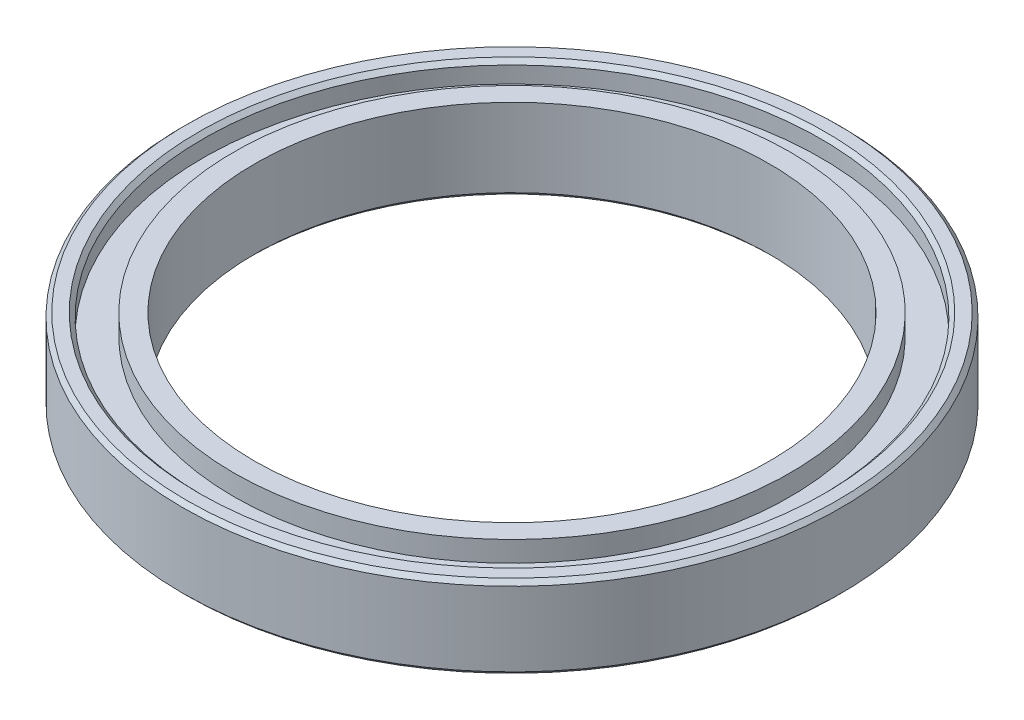
ISO-10303-21;
HEADER;
FILE_DESCRIPTION(('STEP AP214'),'2;1');
FILE_NAME('part.step','',(''),(''),'','','');
FILE_SCHEMA(('AUTOMOTIVE_DESIGN { 1 0 10303 214 1 1 1 1 }'));
ENDSEC;
DATA;
#1=APPLICATION_CONTEXT('core data for automotive mechanical design processes');
#2=APPLICATION_PROTOCOL_DEFINITION('international standard','automotive_design',2000,#1);
#3=PRODUCT_CONTEXT('',#1,'mechanical');
#4=PRODUCT('Part','Part','',(#3));
#5=PRODUCT_RELATED_PRODUCT_CATEGORY('part','',(#4));
#6=PRODUCT_DEFINITION_FORMATION('','',#4);
#7=PRODUCT_DEFINITION_CONTEXT('part definition',#1,'design');
#8=PRODUCT_DEFINITION('design','',#6,#7);
#9=PRODUCT_DEFINITION_SHAPE('','',#8);
#10=(LENGTH_UNIT() NAMED_UNIT(*) SI_UNIT(.MILLI.,.METRE.));
#11=(NAMED_UNIT(*) PLANE_ANGLE_UNIT() SI_UNIT($,.RADIAN.));
#12=(NAMED_UNIT(*) SI_UNIT($,.STERADIAN.) SOLID_ANGLE_UNIT());
#13=UNCERTAINTY_MEASURE_WITH_UNIT(LENGTH_MEASURE(1.E-05),#10,'distance_accuracy_value','');
#14=(GEOMETRIC_REPRESENTATION_CONTEXT(3) GLOBAL_UNCERTAINTY_ASSIGNED_CONTEXT((#13)) GLOBAL_UNIT_ASSIGNED_CONTEXT((#10,
#11,#12)) REPRESENTATION_CONTEXT('',''));
#15=CARTESIAN_POINT('',(0.,0.,0.));
#16=DIRECTION('',(0.,0.,1.));
#17=DIRECTION('',(1.,0.,0.));
#18=AXIS2_PLACEMENT_3D('',#15,#16,#17);
#19=CARTESIAN_POINT('',(0.,0.,0.));
#20=DIRECTION('',(0.,1.,0.));
#21=DIRECTION('',(0.,0.,1.));
#22=AXIS2_PLACEMENT_3D('',#19,#20,#21);
#23=PLANE('',#22);
#24=CARTESIAN_POINT('',(0.,0.,0.));
#25=DIRECTION('',(0.,1.,0.));
#26=DIRECTION('',(0.,0.,1.));
#27=AXIS2_PLACEMENT_3D('',#24,#25,#26);
#28=CIRCLE('',#27,13.3);
#29=CARTESIAN_POINT('',(0.,0.,13.3));
#30=VERTEX_POINT('',#29);
#31=EDGE_CURVE('E55',#30,#30,#28,.F.);
#32=ORIENTED_EDGE('',*,*,#31,.T.);
#33=EDGE_LOOP('',(#32));
#34=FACE_BOUND('',#33,.T.);
#35=CARTESIAN_POINT('',(0.,0.,0.));
#36=DIRECTION('',(0.,1.,0.));
#37=DIRECTION('',(0.,0.,1.));
#38=AXIS2_PLACEMENT_3D('',#35,#36,#37);
#39=CIRCLE('',#38,12.7);
#40=CARTESIAN_POINT('',(0.,0.,12.7));
#41=VERTEX_POINT('',#40);
#42=EDGE_CURVE('E59',#41,#41,#39,.T.);
#43=ORIENTED_EDGE('',*,*,#42,.T.);
#44=EDGE_LOOP('',(#43));
#45=FACE_BOUND('',#44,.T.);
#46=ADVANCED_FACE('F43',(#34,#45),#23,.F.);
#47=CARTESIAN_POINT('',(0.,4.,0.));
#48=DIRECTION('',(0.,1.,0.));
#49=DIRECTION('',(0.,0.,1.));
#50=AXIS2_PLACEMENT_3D('',#47,#48,#49);
#51=PLANE('',#50);
#52=CARTESIAN_POINT('',(0.,4.,0.));
#53=DIRECTION('',(0.,1.,0.));
#54=DIRECTION('',(0.,0.,1.));
#55=AXIS2_PLACEMENT_3D('',#52,#53,#54);
#56=CIRCLE('',#55,12.5);
#57=CARTESIAN_POINT('',(0.,4.,12.5));
#58=VERTEX_POINT('',#57);
#59=EDGE_CURVE('E88',#58,#58,#56,.T.);
#60=ORIENTED_EDGE('',*,*,#59,.F.);
#61=EDGE_LOOP('',(#60));
#62=FACE_BOUND('',#61,.T.);
#63=CARTESIAN_POINT('',(0.,4.,0.));
#64=DIRECTION('',(0.,1.,0.));
#65=DIRECTION('',(0.,0.,1.));
#66=AXIS2_PLACEMENT_3D('',#63,#64,#65);
#67=CIRCLE('',#66,13.5);
#68=CARTESIAN_POINT('',(0.,4.,13.5));
#69=VERTEX_POINT('',#68);
#70=EDGE_CURVE('E95',#69,#69,#67,.T.);
#71=ORIENTED_EDGE('',*,*,#70,.T.);
#72=EDGE_LOOP('',(#71));
#73=FACE_BOUND('',#72,.T.);
#74=ADVANCED_FACE('F129',(#62,#73),#51,.T.);
#75=CARTESIAN_POINT('',(0.,4.,0.));
#76=DIRECTION('',(0.,1.,0.));
#77=DIRECTION('',(0.,0.,1.));
#78=AXIS2_PLACEMENT_3D('',#75,#76,#77);
#79=CIRCLE('',#78,15.8);
#80=CARTESIAN_POINT('',(0.,4.,15.8));
#81=VERTEX_POINT('',#80);
#82=EDGE_CURVE('E82',#81,#81,#79,.T.);
#83=ORIENTED_EDGE('',*,*,#82,.T.);
#84=EDGE_LOOP('',(#83));
#85=FACE_BOUND('',#84,.T.);
#86=CARTESIAN_POINT('',(0.,4.,0.));
#87=DIRECTION('',(0.,1.,0.));
#88=DIRECTION('',(0.,0.,1.));
#89=AXIS2_PLACEMENT_3D('',#86,#87,#88);
#90=CIRCLE('',#89,15.2);
#91=CARTESIAN_POINT('',(0.,4.,15.2));
#92=VERTEX_POINT('',#91);
#93=EDGE_CURVE('E85',#92,#92,#90,.F.);
#94=ORIENTED_EDGE('',*,*,#93,.T.);
#95=EDGE_LOOP('',(#94));
#96=FACE_BOUND('',#95,.T.);
#97=ADVANCED_FACE('F137',(#85,#96),#51,.T.);
#98=CARTESIAN_POINT('',(0.,0.,0.));
#99=DIRECTION('',(0.,1.,0.));
#100=DIRECTION('',(0.,0.,1.));
#101=AXIS2_PLACEMENT_3D('',#98,#99,#100);
#102=CIRCLE('',#101,15.8);
#103=CARTESIAN_POINT('',(0.,0.,15.8));
#104=VERTEX_POINT('',#103);
#105=EDGE_CURVE('E67',#104,#104,#102,.F.);
#106=ORIENTED_EDGE('',*,*,#105,.T.);
#107=EDGE_LOOP('',(#106));
#108=FACE_BOUND('',#107,.T.);
#109=CARTESIAN_POINT('',(0.,0.,0.));
#110=DIRECTION('',(0.,1.,0.));
#111=DIRECTION('',(0.,0.,1.));
#112=AXIS2_PLACEMENT_3D('',#109,#110,#111);
#113=CIRCLE('',#112,15.2);
#114=CARTESIAN_POINT('',(0.,0.,15.2));
#115=VERTEX_POINT('',#114);
#116=EDGE_CURVE('E70',#115,#115,#113,.T.);
#117=ORIENTED_EDGE('',*,*,#116,.T.);
#118=EDGE_LOOP('',(#117));
#119=FACE_BOUND('',#118,.T.);
#120=ADVANCED_FACE('F132',(#108,#119),#23,.F.);
#121=CARTESIAN_POINT('',(0.,4.,0.));
#122=DIRECTION('',(0.,-1.,0.));
#123=DIRECTION('',(0.,0.,-1.));
#124=AXIS2_PLACEMENT_3D('',#121,#122,#123);
#125=CYLINDRICAL_SURFACE('',#124,16.);
#126=CARTESIAN_POINT('',(0.,3.8,0.));
#127=DIRECTION('',(0.,1.,0.));
#128=DIRECTION('',(0.,0.,1.));
#129=AXIS2_PLACEMENT_3D('',#126,#127,#128);
#130=CIRCLE('',#129,16.);
#131=CARTESIAN_POINT('',(0.,3.8,16.));
#132=VERTEX_POINT('',#131);
#133=EDGE_CURVE('E76',#132,#132,#130,.F.);
#134=ORIENTED_EDGE('',*,*,#133,.T.);
#135=EDGE_LOOP('',(#134));
#136=FACE_BOUND('',#135,.T.);
#137=CARTESIAN_POINT('',(0.,0.199999999999999,0.));
#138=DIRECTION('',(0.,1.,0.));
#139=DIRECTION('',(0.,0.,1.));
#140=AXIS2_PLACEMENT_3D('',#137,#138,#139);
#141=CIRCLE('',#140,16.);
#142=CARTESIAN_POINT('',(0.,0.199999999999999,16.));
#143=VERTEX_POINT('',#142);
#144=EDGE_CURVE('E79',#143,#143,#141,.T.);
#145=ORIENTED_EDGE('',*,*,#144,.T.);
#146=EDGE_LOOP('',(#145));
#147=FACE_BOUND('',#146,.T.);
#148=ADVANCED_FACE('F143',(#136,#147),#125,.T.);
#149=CARTESIAN_POINT('',(0.,4.,0.));
#150=DIRECTION('',(0.,-1.,0.));
#151=DIRECTION('',(0.,0.,-1.));
#152=AXIS2_PLACEMENT_3D('',#149,#150,#151);
#153=CYLINDRICAL_SURFACE('',#152,12.5);
#154=CARTESIAN_POINT('',(0.,0.19999999999999,0.));
#155=DIRECTION('',(0.,1.,0.));
#156=DIRECTION('',(0.,0.,1.));
#157=AXIS2_PLACEMENT_3D('',#154,#155,#156);
#158=CIRCLE('',#157,12.5);
#159=CARTESIAN_POINT('',(0.,0.19999999999999,12.5));
#160=VERTEX_POINT('',#159);
#161=EDGE_CURVE('E10',#160,#160,#158,.F.);
#162=ORIENTED_EDGE('',*,*,#161,.T.);
#163=EDGE_LOOP('',(#162));
#164=FACE_BOUND('',#163,.T.);
#165=ORIENTED_EDGE('',*,*,#59,.T.);
#166=EDGE_LOOP('',(#165));
#167=FACE_BOUND('',#166,.T.);
#168=ADVANCED_FACE('F148',(#164,#167),#153,.F.);
#169=CARTESIAN_POINT('',(0.,3.,0.));
#170=DIRECTION('',(0.,1.,0.));
#171=DIRECTION('',(0.,0.,1.));
#172=AXIS2_PLACEMENT_3D('',#169,#170,#171);
#173=CYLINDRICAL_SURFACE('',#172,15.);
#174=CARTESIAN_POINT('',(0.,3.8,0.));
#175=DIRECTION('',(0.,1.,0.));
#176=DIRECTION('',(0.,0.,1.));
#177=AXIS2_PLACEMENT_3D('',#174,#175,#176);
#178=CIRCLE('',#177,15.);
#179=CARTESIAN_POINT('',(0.,3.8,15.));
#180=VERTEX_POINT('',#179);
#181=EDGE_CURVE('E73',#180,#180,#178,.T.);
#182=ORIENTED_EDGE('',*,*,#181,.T.);
#183=EDGE_LOOP('',(#182));
#184=FACE_BOUND('',#183,.T.);
#185=CARTESIAN_POINT('',(0.,3.,0.));
#186=DIRECTION('',(0.,1.,0.));
#187=DIRECTION('',(0.,0.,1.));
#188=AXIS2_PLACEMENT_3D('',#185,#186,#187);
#189=CIRCLE('',#188,15.);
#190=CARTESIAN_POINT('',(0.,3.,15.));
#191=VERTEX_POINT('',#190);
#192=EDGE_CURVE('E91',#191,#191,#189,.T.);
#193=ORIENTED_EDGE('',*,*,#192,.F.);
#194=EDGE_LOOP('',(#193));
#195=FACE_BOUND('',#194,.T.);
#196=ADVANCED_FACE('F205',(#184,#195),#173,.F.);
#197=CARTESIAN_POINT('',(0.,3.,0.));
#198=DIRECTION('',(0.,1.,0.));
#199=DIRECTION('',(0.,0.,1.));
#200=AXIS2_PLACEMENT_3D('',#197,#198,#199);
#201=PLANE('',#200);
#202=CARTESIAN_POINT('',(0.,3.,0.));
#203=DIRECTION('',(0.,1.,0.));
#204=DIRECTION('',(0.,0.,1.));
#205=AXIS2_PLACEMENT_3D('',#202,#203,#204);
#206=CIRCLE('',#205,13.5);
#207=CARTESIAN_POINT('',(0.,3.,13.5));
#208=VERTEX_POINT('',#207);
#209=EDGE_CURVE('E94',#208,#208,#206,.T.);
#210=ORIENTED_EDGE('',*,*,#209,.F.);
#211=EDGE_LOOP('',(#210));
#212=FACE_BOUND('',#211,.T.);
#213=ORIENTED_EDGE('',*,*,#192,.T.);
#214=EDGE_LOOP('',(#213));
#215=FACE_BOUND('',#214,.T.);
#216=ADVANCED_FACE('F125',(#212,#215),#201,.T.);
#217=CARTESIAN_POINT('',(0.,3.,0.));
#218=DIRECTION('',(0.,1.,0.));
#219=DIRECTION('',(0.,0.,1.));
#220=AXIS2_PLACEMENT_3D('',#217,#218,#219);
#221=CYLINDRICAL_SURFACE('',#220,13.5);
#222=ORIENTED_EDGE('',*,*,#209,.T.);
#223=EDGE_LOOP('',(#222));
#224=FACE_BOUND('',#223,.T.);
#225=ORIENTED_EDGE('',*,*,#70,.F.);
#226=EDGE_LOOP('',(#225));
#227=FACE_BOUND('',#226,.T.);
#228=ADVANCED_FACE('F117',(#224,#227),#221,.T.);
#229=CARTESIAN_POINT('',(0.,1.,0.));
#230=DIRECTION('',(0.,-1.,0.));
#231=DIRECTION('',(0.,0.,-1.));
#232=AXIS2_PLACEMENT_3D('',#229,#230,#231);
#233=CYLINDRICAL_SURFACE('',#232,15.);
#234=CARTESIAN_POINT('',(0.,0.199999999999997,0.));
#235=DIRECTION('',(0.,1.,0.));
#236=DIRECTION('',(0.,0.,1.));
#237=AXIS2_PLACEMENT_3D('',#234,#235,#236);
#238=CIRCLE('',#237,15.);
#239=CARTESIAN_POINT('',(0.,0.199999999999997,15.));
#240=VERTEX_POINT('',#239);
#241=EDGE_CURVE('E64',#240,#240,#238,.F.);
#242=ORIENTED_EDGE('',*,*,#241,.T.);
#243=EDGE_LOOP('',(#242));
#244=FACE_BOUND('',#243,.T.);
#245=CARTESIAN_POINT('',(0.,1.,0.));
#246=DIRECTION('',(0.,-1.,0.));
#247=DIRECTION('',(0.,0.,-1.));
#248=AXIS2_PLACEMENT_3D('',#245,#246,#247);
#249=CIRCLE('',#248,15.);
#250=CARTESIAN_POINT('',(0.,1.,-15.));
#251=VERTEX_POINT('',#250);
#252=EDGE_CURVE('E98',#251,#251,#249,.T.);
#253=ORIENTED_EDGE('',*,*,#252,.F.);
#254=EDGE_LOOP('',(#253));
#255=FACE_BOUND('',#254,.T.);
#256=ADVANCED_FACE('F112',(#244,#255),#233,.F.);
#257=CARTESIAN_POINT('',(0.,1.,0.));
#258=DIRECTION('',(0.,-1.,0.));
#259=DIRECTION('',(0.,0.,-1.));
#260=AXIS2_PLACEMENT_3D('',#257,#258,#259);
#261=PLANE('',#260);
#262=CARTESIAN_POINT('',(0.,1.,0.));
#263=DIRECTION('',(0.,-1.,0.));
#264=DIRECTION('',(0.,0.,-1.));
#265=AXIS2_PLACEMENT_3D('',#262,#263,#264);
#266=CIRCLE('',#265,13.5);
#267=CARTESIAN_POINT('',(0.,1.,-13.5));
#268=VERTEX_POINT('',#267);
#269=EDGE_CURVE('E103',#268,#268,#266,.T.);
#270=ORIENTED_EDGE('',*,*,#269,.F.);
#271=EDGE_LOOP('',(#270));
#272=FACE_BOUND('',#271,.T.);
#273=ORIENTED_EDGE('',*,*,#252,.T.);
#274=EDGE_LOOP('',(#273));
#275=FACE_BOUND('',#274,.T.);
#276=ADVANCED_FACE('F109',(#272,#275),#261,.T.);
#277=CARTESIAN_POINT('',(0.,1.,0.));
#278=DIRECTION('',(0.,-1.,0.));
#279=DIRECTION('',(0.,0.,-1.));
#280=AXIS2_PLACEMENT_3D('',#277,#278,#279);
#281=CYLINDRICAL_SURFACE('',#280,13.5);
#282=CARTESIAN_POINT('',(0.,0.200000000000004,0.));
#283=DIRECTION('',(0.,1.,0.));
#284=DIRECTION('',(0.,0.,1.));
#285=AXIS2_PLACEMENT_3D('',#282,#283,#284);
#286=CIRCLE('',#285,13.5);
#287=CARTESIAN_POINT('',(0.,0.200000000000004,13.5));
#288=VERTEX_POINT('',#287);
#289=EDGE_CURVE('E51',#288,#288,#286,.T.);
#290=ORIENTED_EDGE('',*,*,#289,.T.);
#291=EDGE_LOOP('',(#290));
#292=FACE_BOUND('',#291,.T.);
#293=ORIENTED_EDGE('',*,*,#269,.T.);
#294=EDGE_LOOP('',(#293));
#295=FACE_BOUND('',#294,.T.);
#296=ADVANCED_FACE('F107',(#292,#295),#281,.T.);
#297=CARTESIAN_POINT('',(0.,4.,0.));
#298=DIRECTION('',(0.,-1.,0.));
#299=DIRECTION('',(0.,0.,-1.));
#300=AXIS2_PLACEMENT_3D('',#297,#298,#299);
#301=CONICAL_SURFACE('',#300,15.8,0.785398163397448);
#302=ORIENTED_EDGE('',*,*,#133,.F.);
#303=EDGE_LOOP('',(#302));
#304=FACE_BOUND('',#303,.T.);
#305=ORIENTED_EDGE('',*,*,#82,.F.);
#306=EDGE_LOOP('',(#305));
#307=FACE_BOUND('',#306,.T.);
#308=ADVANCED_FACE('F188',(#304,#307),#301,.T.);
#309=CARTESIAN_POINT('',(0.,3.8,0.));
#310=DIRECTION('',(0.,1.,0.));
#311=DIRECTION('',(0.,0.,1.));
#312=AXIS2_PLACEMENT_3D('',#309,#310,#311);
#313=CONICAL_SURFACE('',#312,15.,0.785398163397457);
#314=ORIENTED_EDGE('',*,*,#93,.F.);
#315=EDGE_LOOP('',(#314));
#316=FACE_BOUND('',#315,.T.);
#317=ORIENTED_EDGE('',*,*,#181,.F.);
#318=EDGE_LOOP('',(#317));
#319=FACE_BOUND('',#318,.T.);
#320=ADVANCED_FACE('F167',(#316,#319),#313,.F.);
#321=CARTESIAN_POINT('',(0.,0.199999999999999,0.));
#322=DIRECTION('',(0.,1.,0.));
#323=DIRECTION('',(0.,0.,1.));
#324=AXIS2_PLACEMENT_3D('',#321,#322,#323);
#325=CONICAL_SURFACE('',#324,16.,0.785398163397448);
#326=ORIENTED_EDGE('',*,*,#105,.F.);
#327=EDGE_LOOP('',(#326));
#328=FACE_BOUND('',#327,.T.);
#329=ORIENTED_EDGE('',*,*,#144,.F.);
#330=EDGE_LOOP('',(#329));
#331=FACE_BOUND('',#330,.T.);
#332=ADVANCED_FACE('F159',(#328,#331),#325,.T.);
#333=CARTESIAN_POINT('',(0.,0.199999999999997,0.));
#334=DIRECTION('',(0.,-1.,0.));
#335=DIRECTION('',(0.,0.,-1.));
#336=AXIS2_PLACEMENT_3D('',#333,#334,#335);
#337=CONICAL_SURFACE('',#336,15.,0.785398163397457);
#338=ORIENTED_EDGE('',*,*,#116,.F.);
#339=EDGE_LOOP('',(#338));
#340=FACE_BOUND('',#339,.T.);
#341=ORIENTED_EDGE('',*,*,#241,.F.);
#342=EDGE_LOOP('',(#341));
#343=FACE_BOUND('',#342,.T.);
#344=ADVANCED_FACE('F155',(#340,#343),#337,.F.);
#345=CARTESIAN_POINT('',(0.,0.,0.));
#346=DIRECTION('',(0.,1.,0.));
#347=DIRECTION('',(0.,0.,1.));
#348=AXIS2_PLACEMENT_3D('',#345,#346,#347);
#349=CONICAL_SURFACE('',#348,13.3,0.785398163397444);
#350=ORIENTED_EDGE('',*,*,#289,.F.);
#351=EDGE_LOOP('',(#350));
#352=FACE_BOUND('',#351,.T.);
#353=ORIENTED_EDGE('',*,*,#31,.F.);
#354=EDGE_LOOP('',(#353));
#355=FACE_BOUND('',#354,.T.);
#356=ADVANCED_FACE('F158',(#352,#355),#349,.T.);
#357=CARTESIAN_POINT('',(0.,0.,0.));
#358=DIRECTION('',(0.,-1.,0.));
#359=DIRECTION('',(0.,0.,-1.));
#360=AXIS2_PLACEMENT_3D('',#357,#358,#359);
#361=CONICAL_SURFACE('',#360,12.7,0.785398163397453);
#362=ORIENTED_EDGE('',*,*,#161,.F.);
#363=EDGE_LOOP('',(#362));
#364=FACE_BOUND('',#363,.T.);
#365=ORIENTED_EDGE('',*,*,#42,.F.);
#366=EDGE_LOOP('',(#365));
#367=FACE_BOUND('',#366,.T.);
#368=ADVANCED_FACE('F46',(#364,#367),#361,.F.);
#369=CLOSED_SHELL('',(#46,#74,#97,#120,#148,#168,#196,#216,#228,#256,#276,#296,#308,#320,#332,
#344,#356,#368));
#370=MANIFOLD_SOLID_BREP('B2',#369);
#371=ADVANCED_BREP_SHAPE_REPRESENTATION('',(#18,#370),#14);
#372=SHAPE_DEFINITION_REPRESENTATION(#9,#371);
ENDSEC;
END-ISO-10303-21;
